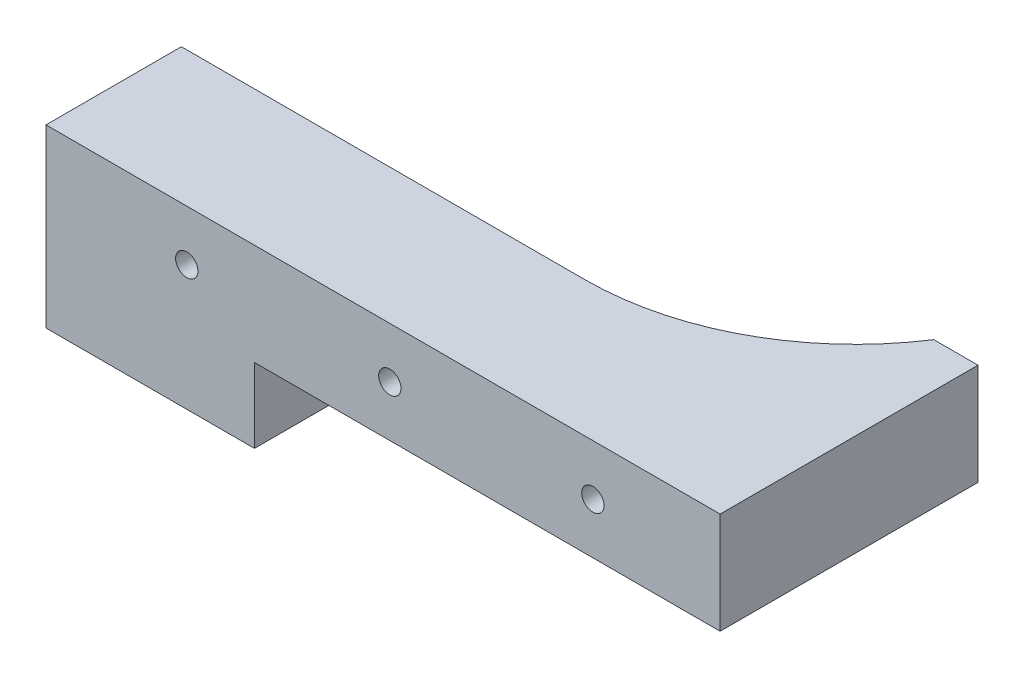
ISO-10303-21;
HEADER;
FILE_DESCRIPTION(('STEP AP214'),'2;1');
FILE_NAME('part.step','',(''),(''),'','','');
FILE_SCHEMA(('AUTOMOTIVE_DESIGN { 1 0 10303 214 1 1 1 1 }'));
ENDSEC;
DATA;
#1=APPLICATION_CONTEXT('core data for automotive mechanical design processes');
#2=APPLICATION_PROTOCOL_DEFINITION('international standard','automotive_design',2000,#1);
#3=PRODUCT_CONTEXT('',#1,'mechanical');
#4=PRODUCT('Part','Part','',(#3));
#5=PRODUCT_RELATED_PRODUCT_CATEGORY('part','',(#4));
#6=PRODUCT_DEFINITION_FORMATION('','',#4);
#7=PRODUCT_DEFINITION_CONTEXT('part definition',#1,'design');
#8=PRODUCT_DEFINITION('design','',#6,#7);
#9=PRODUCT_DEFINITION_SHAPE('','',#8);
#10=(LENGTH_UNIT() NAMED_UNIT(*) SI_UNIT(.MILLI.,.METRE.));
#11=(NAMED_UNIT(*) PLANE_ANGLE_UNIT() SI_UNIT($,.RADIAN.));
#12=(NAMED_UNIT(*) SI_UNIT($,.STERADIAN.) SOLID_ANGLE_UNIT());
#13=UNCERTAINTY_MEASURE_WITH_UNIT(LENGTH_MEASURE(1.E-05),#10,'distance_accuracy_value','');
#14=(GEOMETRIC_REPRESENTATION_CONTEXT(3) GLOBAL_UNCERTAINTY_ASSIGNED_CONTEXT((#13)) GLOBAL_UNIT_ASSIGNED_CONTEXT((#10,
#11,#12)) REPRESENTATION_CONTEXT('',''));
#15=CARTESIAN_POINT('',(0.,0.,0.));
#16=DIRECTION('',(0.,0.,1.));
#17=DIRECTION('',(1.,0.,0.));
#18=AXIS2_PLACEMENT_3D('',#15,#16,#17);
#19=CARTESIAN_POINT('',(0.,1.,-170.468444516164));
#20=DIRECTION('',(0.,1.,0.));
#21=DIRECTION('',(0.,0.,1.));
#22=AXIS2_PLACEMENT_3D('',#19,#20,#21);
#23=PLANE('',#22);
#24=DIRECTION('',(-1.,0.,0.));
#25=VECTOR('',#24,1.);
#26=CARTESIAN_POINT('',(0.,1.,-19.9999999999999));
#27=LINE('',#26,#25);
#28=CARTESIAN_POINT('',(-106.9,1.,-20.));
#29=VERTEX_POINT('',#28);
#30=CARTESIAN_POINT('',(-137.699495780971,1.,-20.));
#31=VERTEX_POINT('',#30);
#32=EDGE_CURVE('E73',#29,#31,#27,.T.);
#33=ORIENTED_EDGE('',*,*,#32,.F.);
#34=DIRECTION('',(0.,0.,1.));
#35=VECTOR('',#34,1.);
#36=CARTESIAN_POINT('',(-106.9,1.,-170.468444516164));
#37=LINE('',#36,#35);
#38=CARTESIAN_POINT('',(-106.9,1.,0.));
#39=VERTEX_POINT('',#38);
#40=EDGE_CURVE('E132',#29,#39,#37,.T.);
#41=ORIENTED_EDGE('',*,*,#40,.T.);
#42=DIRECTION('',(-1.,0.,0.));
#43=VECTOR('',#42,1.);
#44=CARTESIAN_POINT('',(0.,1.,0.));
#45=LINE('',#44,#43);
#46=CARTESIAN_POINT('',(-137.699495780971,1.,0.));
#47=VERTEX_POINT('',#46);
#48=EDGE_CURVE('E126',#39,#47,#45,.T.);
#49=ORIENTED_EDGE('',*,*,#48,.T.);
#50=DIRECTION('',(0.,0.,1.));
#51=VECTOR('',#50,1.);
#52=CARTESIAN_POINT('',(-137.699495780971,1.,-170.468444516164));
#53=LINE('',#52,#51);
#54=EDGE_CURVE('E131',#31,#47,#53,.T.);
#55=ORIENTED_EDGE('',*,*,#54,.F.);
#56=EDGE_LOOP('',(#33,#41,#49,#55));
#57=FACE_BOUND('',#56,.T.);
#58=ADVANCED_FACE('F35',(#57),#23,.F.);
#59=CARTESIAN_POINT('',(-137.699495780971,0.,-170.468444516164));
#60=DIRECTION('',(-1.,0.,0.));
#61=DIRECTION('',(0.,0.,1.));
#62=AXIS2_PLACEMENT_3D('',#59,#60,#61);
#63=PLANE('',#62);
#64=CARTESIAN_POINT('',(-137.699495780971,14.,-10.6985077093654));
#65=DIRECTION('',(-1.,0.,0.));
#66=DIRECTION('',(0.,0.,1.));
#67=AXIS2_PLACEMENT_3D('',#64,#65,#66);
#68=CIRCLE('',#67,1.65);
#69=CARTESIAN_POINT('',(-137.699495780971,14.,-9.04850770936542));
#70=VERTEX_POINT('',#69);
#71=EDGE_CURVE('E342',#70,#70,#68,.T.);
#72=ORIENTED_EDGE('',*,*,#71,.F.);
#73=EDGE_LOOP('',(#72));
#74=FACE_BOUND('',#73,.T.);
#75=DIRECTION('',(0.,0.,1.));
#76=VECTOR('',#75,1.);
#77=CARTESIAN_POINT('',(-137.699495780971,27.,-170.468444516164));
#78=LINE('',#77,#76);
#79=CARTESIAN_POINT('',(-137.699495780971,27.,-20.));
#80=VERTEX_POINT('',#79);
#81=CARTESIAN_POINT('',(-137.699495780971,27.,0.));
#82=VERTEX_POINT('',#81);
#83=EDGE_CURVE('E137',#80,#82,#78,.T.);
#84=ORIENTED_EDGE('',*,*,#83,.F.);
#85=DIRECTION('',(0.,1.,0.));
#86=VECTOR('',#85,1.);
#87=CARTESIAN_POINT('',(-137.699495780971,1.,-20.));
#88=LINE('',#87,#86);
#89=EDGE_CURVE('E173',#31,#80,#88,.T.);
#90=ORIENTED_EDGE('',*,*,#89,.F.);
#91=ORIENTED_EDGE('',*,*,#54,.T.);
#92=DIRECTION('',(0.,-1.,0.));
#93=VECTOR('',#92,1.);
#94=CARTESIAN_POINT('',(-137.699495780971,0.,0.));
#95=LINE('',#94,#93);
#96=EDGE_CURVE('E151',#82,#47,#95,.T.);
#97=ORIENTED_EDGE('',*,*,#96,.F.);
#98=EDGE_LOOP('',(#84,#90,#91,#97));
#99=FACE_BOUND('',#98,.T.);
#100=ADVANCED_FACE('F219',(#74,#99),#63,.T.);
#101=CARTESIAN_POINT('',(0.,27.,-170.468444516164));
#102=DIRECTION('',(0.,1.,0.));
#103=DIRECTION('',(0.,0.,1.));
#104=AXIS2_PLACEMENT_3D('',#101,#102,#103);
#105=PLANE('',#104);
#106=CARTESIAN_POINT('',(-78.1,27.,-60.));
#107=DIRECTION('',(0.,1.,0.));
#108=DIRECTION('',(0.,0.,1.));
#109=AXIS2_PLACEMENT_3D('',#106,#107,#108);
#110=CIRCLE('',#109,40.);
#111=CARTESIAN_POINT('',(-78.1,27.,-20.));
#112=VERTEX_POINT('',#111);
#113=CARTESIAN_POINT('',(-44.6277727063166,27.,-38.1));
#114=VERTEX_POINT('',#113);
#115=EDGE_CURVE('E39',#112,#114,#110,.T.);
#116=ORIENTED_EDGE('',*,*,#115,.F.);
#117=DIRECTION('',(-1.,0.,0.));
#118=VECTOR('',#117,1.);
#119=CARTESIAN_POINT('',(-1.45011746164391E-13,27.,-19.9999999999999));
#120=LINE('',#119,#118);
#121=EDGE_CURVE('E66',#112,#80,#120,.T.);
#122=ORIENTED_EDGE('',*,*,#121,.T.);
#123=ORIENTED_EDGE('',*,*,#83,.T.);
#124=DIRECTION('',(-1.,0.,0.));
#125=VECTOR('',#124,1.);
#126=CARTESIAN_POINT('',(0.,27.,0.));
#127=LINE('',#126,#125);
#128=CARTESIAN_POINT('',(-38.0999999999996,27.,0.));
#129=VERTEX_POINT('',#128);
#130=EDGE_CURVE('E120',#129,#82,#127,.T.);
#131=ORIENTED_EDGE('',*,*,#130,.F.);
#132=DIRECTION('',(0.,0.,-1.));
#133=VECTOR('',#132,1.);
#134=CARTESIAN_POINT('',(-38.0999999999996,27.,-170.468444516164));
#135=LINE('',#134,#133);
#136=CARTESIAN_POINT('',(-38.0999999999996,27.,-38.0999999999999));
#137=VERTEX_POINT('',#136);
#138=EDGE_CURVE('E166',#129,#137,#135,.T.);
#139=ORIENTED_EDGE('',*,*,#138,.T.);
#140=DIRECTION('',(1.,0.,0.));
#141=VECTOR('',#140,1.);
#142=CARTESIAN_POINT('',(-1.16048385664016E-13,27.,-38.0999999999999));
#143=LINE('',#142,#141);
#144=EDGE_CURVE('E147',#114,#137,#143,.T.);
#145=ORIENTED_EDGE('',*,*,#144,.F.);
#146=EDGE_LOOP('',(#116,#122,#123,#131,#139,#145));
#147=FACE_BOUND('',#146,.T.);
#148=ADVANCED_FACE('F164',(#147),#105,.T.);
#149=CARTESIAN_POINT('',(0.,12.,-170.468444516164));
#150=DIRECTION('',(0.,-1.,0.));
#151=DIRECTION('',(0.,0.,-1.));
#152=AXIS2_PLACEMENT_3D('',#149,#150,#151);
#153=PLANE('',#152);
#154=DIRECTION('',(0.,0.,1.));
#155=VECTOR('',#154,1.);
#156=CARTESIAN_POINT('',(-106.9,12.,-170.468444516164));
#157=LINE('',#156,#155);
#158=CARTESIAN_POINT('',(-106.9,12.,-20.));
#159=VERTEX_POINT('',#158);
#160=CARTESIAN_POINT('',(-106.9,12.,0.));
#161=VERTEX_POINT('',#160);
#162=EDGE_CURVE('E104',#159,#161,#157,.T.);
#163=ORIENTED_EDGE('',*,*,#162,.F.);
#164=DIRECTION('',(1.,0.,0.));
#165=VECTOR('',#164,1.);
#166=CARTESIAN_POINT('',(-1.45011746164391E-13,12.,-19.9999999999999));
#167=LINE('',#166,#165);
#168=CARTESIAN_POINT('',(-78.1,12.,-20.));
#169=VERTEX_POINT('',#168);
#170=EDGE_CURVE('E356',#159,#169,#167,.T.);
#171=ORIENTED_EDGE('',*,*,#170,.T.);
#172=CARTESIAN_POINT('',(-78.1,12.,-60.));
#173=DIRECTION('',(0.,-1.,0.));
#174=DIRECTION('',(0.,0.,-1.));
#175=AXIS2_PLACEMENT_3D('',#172,#173,#174);
#176=CIRCLE('',#175,40.);
#177=CARTESIAN_POINT('',(-44.6277727063166,12.,-38.1));
#178=VERTEX_POINT('',#177);
#179=EDGE_CURVE('E171',#178,#169,#176,.T.);
#180=ORIENTED_EDGE('',*,*,#179,.F.);
#181=DIRECTION('',(-1.,0.,0.));
#182=VECTOR('',#181,1.);
#183=CARTESIAN_POINT('',(-1.16048385664016E-13,12.,-38.0999999999999));
#184=LINE('',#183,#182);
#185=CARTESIAN_POINT('',(-38.0999999999996,12.,-38.1));
#186=VERTEX_POINT('',#185);
#187=EDGE_CURVE('E150',#186,#178,#184,.T.);
#188=ORIENTED_EDGE('',*,*,#187,.F.);
#189=DIRECTION('',(0.,0.,1.));
#190=VECTOR('',#189,1.);
#191=CARTESIAN_POINT('',(-38.0999999999996,12.,-170.468444516164));
#192=LINE('',#191,#190);
#193=CARTESIAN_POINT('',(-38.0999999999996,12.,0.));
#194=VERTEX_POINT('',#193);
#195=EDGE_CURVE('E52',#186,#194,#192,.T.);
#196=ORIENTED_EDGE('',*,*,#195,.T.);
#197=DIRECTION('',(1.,0.,0.));
#198=VECTOR('',#197,1.);
#199=CARTESIAN_POINT('',(0.,12.,0.));
#200=LINE('',#199,#198);
#201=EDGE_CURVE('E115',#161,#194,#200,.T.);
#202=ORIENTED_EDGE('',*,*,#201,.F.);
#203=EDGE_LOOP('',(#163,#171,#180,#188,#196,#202));
#204=FACE_BOUND('',#203,.T.);
#205=ADVANCED_FACE('F116',(#204),#153,.T.);
#206=CARTESIAN_POINT('',(-116.9,19.5,-170.468444516164));
#207=DIRECTION('',(0.,0.,1.));
#208=DIRECTION('',(1.,0.,0.));
#209=AXIS2_PLACEMENT_3D('',#206,#207,#208);
#210=CYLINDRICAL_SURFACE('',#209,1.65);
#211=CARTESIAN_POINT('',(-116.9,19.5,0.));
#212=DIRECTION('',(0.,0.,1.));
#213=DIRECTION('',(1.,0.,0.));
#214=AXIS2_PLACEMENT_3D('',#211,#212,#213);
#215=CIRCLE('',#214,1.65);
#216=CARTESIAN_POINT('',(-115.25,19.5,0.));
#217=VERTEX_POINT('',#216);
#218=EDGE_CURVE('E133',#217,#217,#215,.T.);
#219=ORIENTED_EDGE('',*,*,#218,.T.);
#220=EDGE_LOOP('',(#219));
#221=FACE_BOUND('',#220,.T.);
#222=CARTESIAN_POINT('',(-116.9,19.5,-20.));
#223=DIRECTION('',(0.,0.,-1.));
#224=DIRECTION('',(-1.,0.,0.));
#225=AXIS2_PLACEMENT_3D('',#222,#223,#224);
#226=CIRCLE('',#225,1.65);
#227=CARTESIAN_POINT('',(-118.55,19.5,-20.));
#228=VERTEX_POINT('',#227);
#229=EDGE_CURVE('E343',#228,#228,#226,.F.);
#230=ORIENTED_EDGE('',*,*,#229,.F.);
#231=EDGE_LOOP('',(#230));
#232=FACE_BOUND('',#231,.T.);
#233=ADVANCED_FACE('F208',(#221,#232),#210,.F.);
#234=CARTESIAN_POINT('',(-86.9,19.5,-170.468444516164));
#235=DIRECTION('',(0.,0.,1.));
#236=DIRECTION('',(1.,0.,0.));
#237=AXIS2_PLACEMENT_3D('',#234,#235,#236);
#238=CYLINDRICAL_SURFACE('',#237,1.65);
#239=CARTESIAN_POINT('',(-86.9,19.5,0.));
#240=DIRECTION('',(0.,0.,1.));
#241=DIRECTION('',(1.,0.,0.));
#242=AXIS2_PLACEMENT_3D('',#239,#240,#241);
#243=CIRCLE('',#242,1.65);
#244=CARTESIAN_POINT('',(-85.25,19.5,0.));
#245=VERTEX_POINT('',#244);
#246=EDGE_CURVE('E136',#245,#245,#243,.T.);
#247=ORIENTED_EDGE('',*,*,#246,.T.);
#248=EDGE_LOOP('',(#247));
#249=FACE_BOUND('',#248,.T.);
#250=CARTESIAN_POINT('',(-86.9,19.5,-20.));
#251=DIRECTION('',(0.,0.,-1.));
#252=DIRECTION('',(-1.,0.,0.));
#253=AXIS2_PLACEMENT_3D('',#250,#251,#252);
#254=CIRCLE('',#253,1.65);
#255=CARTESIAN_POINT('',(-88.55,19.5,-20.));
#256=VERTEX_POINT('',#255);
#257=EDGE_CURVE('E354',#256,#256,#254,.F.);
#258=ORIENTED_EDGE('',*,*,#257,.F.);
#259=EDGE_LOOP('',(#258));
#260=FACE_BOUND('',#259,.T.);
#261=ADVANCED_FACE('F210',(#249,#260),#238,.F.);
#262=CARTESIAN_POINT('',(-106.9,0.,-170.468444516164));
#263=DIRECTION('',(1.,0.,0.));
#264=DIRECTION('',(0.,0.,-1.));
#265=AXIS2_PLACEMENT_3D('',#262,#263,#264);
#266=PLANE('',#265);
#267=ORIENTED_EDGE('',*,*,#40,.F.);
#268=DIRECTION('',(0.,1.,0.));
#269=VECTOR('',#268,1.);
#270=CARTESIAN_POINT('',(-106.9,0.,-20.));
#271=LINE('',#270,#269);
#272=EDGE_CURVE('E11',#29,#159,#271,.T.);
#273=ORIENTED_EDGE('',*,*,#272,.T.);
#274=ORIENTED_EDGE('',*,*,#162,.T.);
#275=DIRECTION('',(0.,1.,0.));
#276=VECTOR('',#275,1.);
#277=CARTESIAN_POINT('',(-106.9,0.,0.));
#278=LINE('',#277,#276);
#279=EDGE_CURVE('E109',#39,#161,#278,.T.);
#280=ORIENTED_EDGE('',*,*,#279,.F.);
#281=EDGE_LOOP('',(#267,#273,#274,#280));
#282=FACE_BOUND('',#281,.T.);
#283=ADVANCED_FACE('F107',(#282),#266,.T.);
#284=CARTESIAN_POINT('',(0.,0.,0.));
#285=DIRECTION('',(0.,0.,1.));
#286=DIRECTION('',(1.,0.,0.));
#287=AXIS2_PLACEMENT_3D('',#284,#285,#286);
#288=PLANE('',#287);
#289=ORIENTED_EDGE('',*,*,#218,.F.);
#290=EDGE_LOOP('',(#289));
#291=FACE_BOUND('',#290,.T.);
#292=ORIENTED_EDGE('',*,*,#246,.F.);
#293=EDGE_LOOP('',(#292));
#294=FACE_BOUND('',#293,.T.);
#295=CARTESIAN_POINT('',(-56.9,19.5,0.));
#296=DIRECTION('',(0.,0.,1.));
#297=DIRECTION('',(1.,0.,0.));
#298=AXIS2_PLACEMENT_3D('',#295,#296,#297);
#299=CIRCLE('',#298,1.65);
#300=CARTESIAN_POINT('',(-55.25,19.5,0.));
#301=VERTEX_POINT('',#300);
#302=EDGE_CURVE('E112',#301,#301,#299,.T.);
#303=ORIENTED_EDGE('',*,*,#302,.F.);
#304=EDGE_LOOP('',(#303));
#305=FACE_BOUND('',#304,.T.);
#306=ORIENTED_EDGE('',*,*,#201,.T.);
#307=DIRECTION('',(0.,1.,0.));
#308=VECTOR('',#307,1.);
#309=CARTESIAN_POINT('',(-38.0999999999996,1.,0.));
#310=LINE('',#309,#308);
#311=EDGE_CURVE('E335',#194,#129,#310,.T.);
#312=ORIENTED_EDGE('',*,*,#311,.T.);
#313=ORIENTED_EDGE('',*,*,#130,.T.);
#314=ORIENTED_EDGE('',*,*,#96,.T.);
#315=ORIENTED_EDGE('',*,*,#48,.F.);
#316=ORIENTED_EDGE('',*,*,#279,.T.);
#317=EDGE_LOOP('',(#306,#312,#313,#314,#315,#316));
#318=FACE_BOUND('',#317,.T.);
#319=ADVANCED_FACE('F123',(#291,#294,#305,#318),#288,.T.);
#320=CARTESIAN_POINT('',(-24.8411999999997,12.0000000000001,-38.1));
#321=DIRECTION('',(0.,0.,1.));
#322=DIRECTION('',(-1.,0.,0.));
#323=AXIS2_PLACEMENT_3D('',#320,#321,#322);
#324=PLANE('',#323);
#325=ORIENTED_EDGE('',*,*,#187,.T.);
#326=DIRECTION('',(0.,1.,0.));
#327=VECTOR('',#326,1.);
#328=CARTESIAN_POINT('',(-44.6277727063166,0.999999999999962,-38.1));
#329=LINE('',#328,#327);
#330=EDGE_CURVE('E45',#178,#114,#329,.T.);
#331=ORIENTED_EDGE('',*,*,#330,.T.);
#332=ORIENTED_EDGE('',*,*,#144,.T.);
#333=DIRECTION('',(0.,1.,0.));
#334=VECTOR('',#333,1.);
#335=CARTESIAN_POINT('',(-38.0999999999996,12.0000000000001,-38.1));
#336=LINE('',#335,#334);
#337=EDGE_CURVE('E154',#186,#137,#336,.T.);
#338=ORIENTED_EDGE('',*,*,#337,.F.);
#339=EDGE_LOOP('',(#325,#331,#332,#338));
#340=FACE_BOUND('',#339,.T.);
#341=ADVANCED_FACE('F37',(#340),#324,.F.);
#342=CARTESIAN_POINT('',(-56.9,19.5,-170.468444516164));
#343=DIRECTION('',(0.,0.,1.));
#344=DIRECTION('',(1.,0.,0.));
#345=AXIS2_PLACEMENT_3D('',#342,#343,#344);
#346=CYLINDRICAL_SURFACE('',#345,1.65);
#347=CARTESIAN_POINT('',(-55.25,19.5,-27.1689552405044));
#348=CARTESIAN_POINT('',(-55.2499957509715,19.4189438785006,-27.1689584174552));
#349=CARTESIAN_POINT('',(-55.2560023012607,19.3379116091547,-27.164775331877));
#350=CARTESIAN_POINT('',(-55.2796349440205,19.1784192829831,-27.148346418025));
#351=CARTESIAN_POINT('',(-55.297260578865,19.0999591249807,-27.1361009072957));
#352=CARTESIAN_POINT('',(-55.3430243979529,18.9480949674373,-27.1043950868166));
#353=CARTESIAN_POINT('',(-55.3711222109216,18.8746728166552,-27.0849624861814));
#354=CARTESIAN_POINT('',(-55.4364753447174,18.7340947747315,-27.0399299212536));
#355=CARTESIAN_POINT('',(-55.4737334203574,18.6669407770411,-27.0143281017061));
#356=CARTESIAN_POINT('',(-55.5588246463767,18.5354794475429,-26.9561163942403));
#357=CARTESIAN_POINT('',(-55.6072133291952,18.4716955287414,-26.9231427696234));
#358=CARTESIAN_POINT('',(-55.7111495144114,18.3531086109838,-26.8527026780898));
#359=CARTESIAN_POINT('',(-55.7667000884275,18.2983094885027,-26.8152342839219));
#360=CARTESIAN_POINT('',(-55.893543537069,18.1893974155571,-26.730192942799));
#361=CARTESIAN_POINT('',(-55.9659016998562,18.1370177169873,-26.6819896328875));
#362=CARTESIAN_POINT('',(-56.1164558657594,18.0452341607573,-26.5824604251546));
#363=CARTESIAN_POINT('',(-56.1946556227964,18.0058387365797,-26.5311325233996));
#364=CARTESIAN_POINT('',(-56.3681648495584,17.9348179787038,-26.4181643230533));
#365=CARTESIAN_POINT('',(-56.4641989243697,17.9054724879866,-26.356196541087));
#366=CARTESIAN_POINT('',(-56.6594766126447,17.8645762384169,-26.2314138648299));
#367=CARTESIAN_POINT('',(-56.7587219255668,17.8530350646263,-26.1685985325975));
#368=CARTESIAN_POINT('',(-56.9670749082609,17.8477873235634,-26.0380229449617));
#369=CARTESIAN_POINT('',(-57.0762694381874,17.8557715164431,-25.970323955628));
#370=CARTESIAN_POINT('',(-57.2925976249644,17.8936300367006,-25.8376213956017));
#371=CARTESIAN_POINT('',(-57.3997305306601,17.9235121932515,-25.7726187977341));
#372=CARTESIAN_POINT('',(-57.6058914758916,18.004602120519,-25.6487895808145));
#373=CARTESIAN_POINT('',(-57.7050467837901,18.0553207889028,-25.5898577535605));
#374=CARTESIAN_POINT('',(-57.8935775149739,18.177921037794,-25.4788119873616));
#375=CARTESIAN_POINT('',(-57.9829699613554,18.2497649482092,-25.4266861490187));
#376=CARTESIAN_POINT('',(-58.1258692994395,18.3922378145485,-25.343989137843));
#377=CARTESIAN_POINT('',(-58.1826763519926,18.4583701682376,-25.3113307387601));
#378=CARTESIAN_POINT('',(-58.2861196968715,18.6006178104585,-25.2521411755229));
#379=CARTESIAN_POINT('',(-58.3327616591164,18.6767274956605,-25.2256065951144));
#380=CARTESIAN_POINT('',(-58.4139311355472,18.8376743870102,-25.1795907915341));
#381=CARTESIAN_POINT('',(-58.4483960157606,18.9225538946475,-25.1601460195581));
#382=CARTESIAN_POINT('',(-58.5029712657285,19.0982197427166,-25.1294183926392));
#383=CARTESIAN_POINT('',(-58.5230878260749,19.189003517278,-25.1181320177222));
#384=CARTESIAN_POINT('',(-58.5466006295435,19.364665525851,-25.1049468622846));
#385=CARTESIAN_POINT('',(-58.5513848531517,19.4493018505429,-25.1022687321229));
#386=CARTESIAN_POINT('',(-58.5479245316687,19.6182080508016,-25.1042072598811));
#387=CARTESIAN_POINT('',(-58.5396839424664,19.7024780298405,-25.1088217029047));
#388=CARTESIAN_POINT('',(-58.5111915169477,19.8648131143217,-25.1248106914358));
#389=CARTESIAN_POINT('',(-58.4914258805219,19.9429918687688,-25.1359116331297));
#390=CARTESIAN_POINT('',(-58.4411936166965,20.0946473200437,-25.1642115487243));
#391=CARTESIAN_POINT('',(-58.4107260124161,20.1681235869021,-25.1814110793085));
#392=CARTESIAN_POINT('',(-58.3389483439716,20.3115490068274,-25.2220961316923));
#393=CARTESIAN_POINT('',(-58.2972565521916,20.381243103635,-25.2458036914068));
#394=CARTESIAN_POINT('',(-58.205274698008,20.5125163442766,-25.2983759991317));
#395=CARTESIAN_POINT('',(-58.1549817093303,20.5740927136533,-25.327242502454));
#396=CARTESIAN_POINT('',(-58.0420491173452,20.6940132130012,-25.3924392705805));
#397=CARTESIAN_POINT('',(-57.978677631508,20.7514173278185,-25.4292273580653));
#398=CARTESIAN_POINT('',(-57.8455709471322,20.8548093892739,-25.5070433973626));
#399=CARTESIAN_POINT('',(-57.7758327307336,20.9007918831843,-25.5480733610774));
#400=CARTESIAN_POINT('',(-57.6222394273379,20.9864706694744,-25.6391167578798));
#401=CARTESIAN_POINT('',(-57.5377409868075,21.0245150488277,-25.6895989558582));
#402=CARTESIAN_POINT('',(-57.365271281828,21.0856881511877,-25.7935505303077));
#403=CARTESIAN_POINT('',(-57.2772983364644,21.1088095585109,-25.8470213579586));
#404=CARTESIAN_POINT('',(-57.0883363788946,21.1423738604738,-25.962905626163));
#405=CARTESIAN_POINT('',(-56.9871416327904,21.1507785325783,-26.0255781446191));
#406=CARTESIAN_POINT('',(-56.7853884354586,21.1491071346794,-26.1517870258084));
#407=CARTESIAN_POINT('',(-56.6848304977035,21.1390176860894,-26.2153239808678));
#408=CARTESIAN_POINT('',(-56.4789661394052,21.0990848959522,-26.3466653522729));
#409=CARTESIAN_POINT('',(-56.373908145794,21.0677505495135,-26.4144124477508));
#410=CARTESIAN_POINT('',(-56.1704585196809,20.9840333454752,-26.5468996311592));
#411=CARTESIAN_POINT('',(-56.0720635345726,20.9316611667741,-26.6116412261235));
#412=CARTESIAN_POINT('',(-55.9026397958724,20.8176506450537,-26.7240989353358));
#413=CARTESIAN_POINT('',(-55.8299026290003,20.7594764894851,-26.7727591456676));
#414=CARTESIAN_POINT('',(-55.6936043547302,20.6295776330362,-26.8645180966431));
#415=CARTESIAN_POINT('',(-55.63003171191,20.557870233874,-26.9076238213518));
#416=CARTESIAN_POINT('',(-55.524117076033,20.4143660646588,-26.9798099944606));
#417=CARTESIAN_POINT('',(-55.4800044599886,20.3444537054695,-27.0100312293142));
#418=CARTESIAN_POINT('',(-55.4019779383904,20.1967060140546,-27.0636668824449));
#419=CARTESIAN_POINT('',(-55.3680616158168,20.1188725653792,-27.0870829138438));
#420=CARTESIAN_POINT('',(-55.3108596593497,19.9529878380245,-27.1266617105251));
#421=CARTESIAN_POINT('',(-55.2881860724877,19.8646210020329,-27.1424061997976));
#422=CARTESIAN_POINT('',(-55.2577637987836,19.6841574437763,-27.1635475949458));
#423=CARTESIAN_POINT('',(-55.2500048260358,19.5920633368214,-27.1689516321317));
#424=CARTESIAN_POINT('',(-55.25,19.5,-27.1689552405044));
#425=B_SPLINE_CURVE_WITH_KNOTS('',3,(#347,#348,#349,#350,#351,#352,#353,#354,#355,#356,#357,
#358,#359,#360,#361,#362,#363,#364,#365,#366,#367,#368,#369,#370,#371,#372,#373,#374,#375,#376,
#377,#378,#379,#380,#381,#382,#383,#384,#385,#386,#387,#388,#389,#390,#391,#392,#393,#394,#395,
#396,#397,#398,#399,#400,#401,#402,#403,#404,#405,#406,#407,#408,#409,#410,#411,#412,#413,#414,
#415,#416,#417,#418,#419,#420,#421,#422,#423,#424),.UNSPECIFIED.,.T.,.F.,(4,2,2,2,2,2,2,2,2,2,2,
2,2,2,2,2,2,2,2,2,2,2,2,2,2,2,2,2,2,2,2,2,2,2,2,2,2,2,4),(0.,0.242808251359261,
0.485606940112005,0.727479138165788,0.969424164860602,1.22820817557297,1.48710354605815,
1.79045004713896,2.09399318984963,2.4465208043279,2.79923813803304,3.18356116040339,
3.56802165676341,3.94393106552085,4.31917418392575,4.59731365482595,4.87529758480079,
5.15469122001067,5.43396423761643,5.68711456331409,5.94018801710796,6.18328709078317,
6.42640836042715,6.6791613940126,6.93200059019087,7.21014041150407,7.48841276377186,
7.80373235273485,8.11920640353642,8.47567965895823,8.83241088774475,9.21719456530348,
9.60178317124748,9.9157949456381,10.2294079549542,10.4923766831931,10.7552830257506,
11.0312544134522,11.3070354083284),.UNSPECIFIED.);
#426=CARTESIAN_POINT('',(-55.25,19.5,-27.1689552405044));
#427=VERTEX_POINT('',#426);
#428=EDGE_CURVE('E168',#427,#427,#425,.T.);
#429=ORIENTED_EDGE('',*,*,#428,.T.);
#430=EDGE_LOOP('',(#429));
#431=FACE_BOUND('',#430,.T.);
#432=ORIENTED_EDGE('',*,*,#302,.T.);
#433=EDGE_LOOP('',(#432));
#434=FACE_BOUND('',#433,.T.);
#435=ADVANCED_FACE('F183',(#431,#434),#346,.F.);
#436=CARTESIAN_POINT('',(-117.699495780971,14.,-10.6985077093654));
#437=DIRECTION('',(-1.,0.,0.));
#438=DIRECTION('',(0.,0.,1.));
#439=AXIS2_PLACEMENT_3D('',#436,#437,#438);
#440=CYLINDRICAL_SURFACE('',#439,1.65);
#441=CARTESIAN_POINT('',(-117.699495780971,14.,-10.6985077093654));
#442=DIRECTION('',(-1.,0.,0.));
#443=DIRECTION('',(0.,0.,1.));
#444=AXIS2_PLACEMENT_3D('',#441,#442,#443);
#445=CIRCLE('',#444,1.65);
#446=CARTESIAN_POINT('',(-117.699495780971,14.,-9.04850770936542));
#447=VERTEX_POINT('',#446);
#448=EDGE_CURVE('E146',#447,#447,#445,.T.);
#449=ORIENTED_EDGE('',*,*,#448,.F.);
#450=EDGE_LOOP('',(#449));
#451=FACE_BOUND('',#450,.T.);
#452=ORIENTED_EDGE('',*,*,#71,.T.);
#453=EDGE_LOOP('',(#452));
#454=FACE_BOUND('',#453,.T.);
#455=ADVANCED_FACE('F200',(#451,#454),#440,.F.);
#456=CARTESIAN_POINT('',(-117.699495780971,14.,-10.6985077093654));
#457=DIRECTION('',(-1.,0.,0.));
#458=DIRECTION('',(0.,0.,1.));
#459=AXIS2_PLACEMENT_3D('',#456,#457,#458);
#460=PLANE('',#459);
#461=ORIENTED_EDGE('',*,*,#448,.T.);
#462=EDGE_LOOP('',(#461));
#463=FACE_BOUND('',#462,.T.);
#464=ADVANCED_FACE('F197',(#463),#460,.T.);
#465=CARTESIAN_POINT('',(-38.0999999999996,1.,0.));
#466=DIRECTION('',(1.,0.,0.));
#467=DIRECTION('',(0.,0.,-1.));
#468=AXIS2_PLACEMENT_3D('',#465,#466,#467);
#469=PLANE('',#468);
#470=ORIENTED_EDGE('',*,*,#311,.F.);
#471=ORIENTED_EDGE('',*,*,#195,.F.);
#472=ORIENTED_EDGE('',*,*,#337,.T.);
#473=ORIENTED_EDGE('',*,*,#138,.F.);
#474=EDGE_LOOP('',(#470,#471,#472,#473));
#475=FACE_BOUND('',#474,.T.);
#476=ADVANCED_FACE('F194',(#475),#469,.T.);
#477=CARTESIAN_POINT('',(0.,1.,-19.9999999999999));
#478=DIRECTION('',(0.,0.,-1.));
#479=DIRECTION('',(-1.,0.,0.));
#480=AXIS2_PLACEMENT_3D('',#477,#478,#479);
#481=PLANE('',#480);
#482=DIRECTION('',(0.,1.,0.));
#483=VECTOR('',#482,1.);
#484=CARTESIAN_POINT('',(-78.1,1.,-20.));
#485=LINE('',#484,#483);
#486=EDGE_CURVE('E334',#169,#112,#485,.T.);
#487=ORIENTED_EDGE('',*,*,#486,.F.);
#488=ORIENTED_EDGE('',*,*,#170,.F.);
#489=ORIENTED_EDGE('',*,*,#272,.F.);
#490=ORIENTED_EDGE('',*,*,#32,.T.);
#491=ORIENTED_EDGE('',*,*,#89,.T.);
#492=ORIENTED_EDGE('',*,*,#121,.F.);
#493=EDGE_LOOP('',(#487,#488,#489,#490,#491,#492));
#494=FACE_BOUND('',#493,.T.);
#495=ORIENTED_EDGE('',*,*,#257,.T.);
#496=EDGE_LOOP('',(#495));
#497=FACE_BOUND('',#496,.T.);
#498=ORIENTED_EDGE('',*,*,#229,.T.);
#499=EDGE_LOOP('',(#498));
#500=FACE_BOUND('',#499,.T.);
#501=ADVANCED_FACE('F191',(#494,#497,#500),#481,.T.);
#502=CARTESIAN_POINT('',(-78.1,1.,-60.));
#503=DIRECTION('',(0.,1.,0.));
#504=DIRECTION('',(0.,0.,1.));
#505=AXIS2_PLACEMENT_3D('',#502,#503,#504);
#506=CYLINDRICAL_SURFACE('',#505,40.);
#507=ORIENTED_EDGE('',*,*,#115,.T.);
#508=ORIENTED_EDGE('',*,*,#330,.F.);
#509=ORIENTED_EDGE('',*,*,#179,.T.);
#510=ORIENTED_EDGE('',*,*,#486,.T.);
#511=EDGE_LOOP('',(#507,#508,#509,#510));
#512=FACE_BOUND('',#511,.T.);
#513=ORIENTED_EDGE('',*,*,#428,.F.);
#514=EDGE_LOOP('',(#513));
#515=FACE_BOUND('',#514,.T.);
#516=ADVANCED_FACE('F187',(#512,#515),#506,.F.);
#517=CLOSED_SHELL('',(#58,#100,#148,#205,#233,#261,#283,#319,#341,#435,#455,#464,#476,#501,#516));
#518=MANIFOLD_SOLID_BREP('B2',#517);
#519=ADVANCED_BREP_SHAPE_REPRESENTATION('',(#18,#518),#14);
#520=SHAPE_DEFINITION_REPRESENTATION(#9,#519);
ENDSEC;
END-ISO-10303-21;
